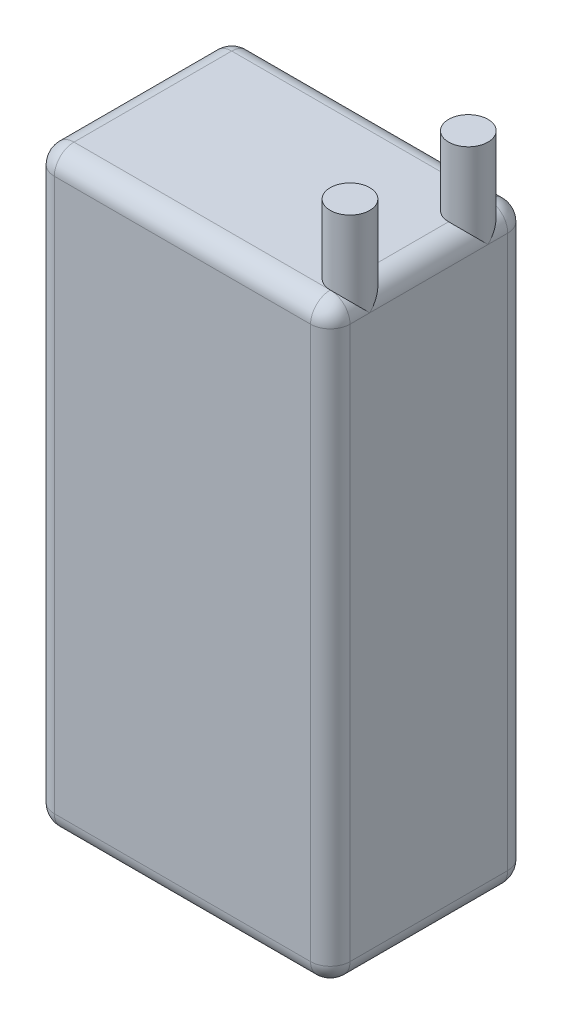
ISO-10303-21;
HEADER;
FILE_DESCRIPTION(('STEP AP214'),'2;1');
FILE_NAME('part.step','',(''),(''),'','','');
FILE_SCHEMA(('AUTOMOTIVE_DESIGN { 1 0 10303 214 1 1 1 1 }'));
ENDSEC;
DATA;
#1=APPLICATION_CONTEXT('core data for automotive mechanical design processes');
#2=APPLICATION_PROTOCOL_DEFINITION('international standard','automotive_design',2000,#1);
#3=PRODUCT_CONTEXT('',#1,'mechanical');
#4=PRODUCT('Part','Part','',(#3));
#5=PRODUCT_RELATED_PRODUCT_CATEGORY('part','',(#4));
#6=PRODUCT_DEFINITION_FORMATION('','',#4);
#7=PRODUCT_DEFINITION_CONTEXT('part definition',#1,'design');
#8=PRODUCT_DEFINITION('design','',#6,#7);
#9=PRODUCT_DEFINITION_SHAPE('','',#8);
#10=(LENGTH_UNIT() NAMED_UNIT(*) SI_UNIT(.MILLI.,.METRE.));
#11=(NAMED_UNIT(*) PLANE_ANGLE_UNIT() SI_UNIT($,.RADIAN.));
#12=(NAMED_UNIT(*) SI_UNIT($,.STERADIAN.) SOLID_ANGLE_UNIT());
#13=UNCERTAINTY_MEASURE_WITH_UNIT(LENGTH_MEASURE(1.E-05),#10,'distance_accuracy_value','');
#14=(GEOMETRIC_REPRESENTATION_CONTEXT(3) GLOBAL_UNCERTAINTY_ASSIGNED_CONTEXT((#13)) GLOBAL_UNIT_ASSIGNED_CONTEXT((#10,
#11,#12)) REPRESENTATION_CONTEXT('',''));
#15=CARTESIAN_POINT('',(0.,0.,0.));
#16=DIRECTION('',(0.,0.,1.));
#17=DIRECTION('',(1.,0.,0.));
#18=AXIS2_PLACEMENT_3D('',#15,#16,#17);
#19=CARTESIAN_POINT('',(-15.,60.,-10.));
#20=DIRECTION('',(1.,0.,0.));
#21=DIRECTION('',(0.,0.,-1.));
#22=AXIS2_PLACEMENT_3D('',#19,#20,#21);
#23=PLANE('',#22);
#24=DIRECTION('',(0.,-1.,0.));
#25=VECTOR('',#24,1.);
#26=CARTESIAN_POINT('',(-15.,60.,-8.));
#27=LINE('',#26,#25);
#28=CARTESIAN_POINT('',(-15.,58.,-8.));
#29=VERTEX_POINT('',#28);
#30=CARTESIAN_POINT('',(-15.,2.,-8.));
#31=VERTEX_POINT('',#30);
#32=EDGE_CURVE('E216',#29,#31,#27,.T.);
#33=ORIENTED_EDGE('',*,*,#32,.T.);
#34=DIRECTION('',(0.,0.,1.));
#35=VECTOR('',#34,1.);
#36=CARTESIAN_POINT('',(-15.,2.,10.));
#37=LINE('',#36,#35);
#38=CARTESIAN_POINT('',(-15.,2.,8.));
#39=VERTEX_POINT('',#38);
#40=EDGE_CURVE('E222',#31,#39,#37,.T.);
#41=ORIENTED_EDGE('',*,*,#40,.T.);
#42=DIRECTION('',(0.,-1.,0.));
#43=VECTOR('',#42,1.);
#44=CARTESIAN_POINT('',(-15.,60.,8.));
#45=LINE('',#44,#43);
#46=CARTESIAN_POINT('',(-15.,58.,8.));
#47=VERTEX_POINT('',#46);
#48=EDGE_CURVE('E220',#39,#47,#45,.F.);
#49=ORIENTED_EDGE('',*,*,#48,.T.);
#50=DIRECTION('',(0.,0.,1.));
#51=VECTOR('',#50,1.);
#52=CARTESIAN_POINT('',(-15.,58.,-10.));
#53=LINE('',#52,#51);
#54=EDGE_CURVE('E218',#47,#29,#53,.F.);
#55=ORIENTED_EDGE('',*,*,#54,.T.);
#56=EDGE_LOOP('',(#33,#41,#49,#55));
#57=FACE_BOUND('',#56,.T.);
#58=ADVANCED_FACE('F38',(#57),#23,.F.);
#59=CARTESIAN_POINT('',(15.,60.,10.));
#60=DIRECTION('',(0.,0.,-1.));
#61=DIRECTION('',(-1.,0.,0.));
#62=AXIS2_PLACEMENT_3D('',#59,#60,#61);
#63=PLANE('',#62);
#64=DIRECTION('',(0.,-1.,0.));
#65=VECTOR('',#64,1.);
#66=CARTESIAN_POINT('',(-13.,60.,10.));
#67=LINE('',#66,#65);
#68=CARTESIAN_POINT('',(-13.,58.,10.));
#69=VERTEX_POINT('',#68);
#70=CARTESIAN_POINT('',(-13.,2.,10.));
#71=VERTEX_POINT('',#70);
#72=EDGE_CURVE('E194',#69,#71,#67,.T.);
#73=ORIENTED_EDGE('',*,*,#72,.T.);
#74=DIRECTION('',(1.,0.,0.));
#75=VECTOR('',#74,1.);
#76=CARTESIAN_POINT('',(15.,2.,10.));
#77=LINE('',#76,#75);
#78=CARTESIAN_POINT('',(13.,2.,10.));
#79=VERTEX_POINT('',#78);
#80=EDGE_CURVE('E196',#71,#79,#77,.T.);
#81=ORIENTED_EDGE('',*,*,#80,.T.);
#82=DIRECTION('',(0.,-1.,0.));
#83=VECTOR('',#82,1.);
#84=CARTESIAN_POINT('',(13.,60.,10.));
#85=LINE('',#84,#83);
#86=CARTESIAN_POINT('',(13.,58.,10.));
#87=VERTEX_POINT('',#86);
#88=EDGE_CURVE('E192',#79,#87,#85,.F.);
#89=ORIENTED_EDGE('',*,*,#88,.T.);
#90=DIRECTION('',(1.,0.,0.));
#91=VECTOR('',#90,1.);
#92=CARTESIAN_POINT('',(15.,58.,10.));
#93=LINE('',#92,#91);
#94=EDGE_CURVE('E190',#87,#69,#93,.F.);
#95=ORIENTED_EDGE('',*,*,#94,.T.);
#96=EDGE_LOOP('',(#73,#81,#89,#95));
#97=FACE_BOUND('',#96,.T.);
#98=ADVANCED_FACE('F337',(#97),#63,.F.);
#99=CARTESIAN_POINT('',(15.,60.,-10.));
#100=DIRECTION('',(-1.,0.,0.));
#101=DIRECTION('',(0.,0.,1.));
#102=AXIS2_PLACEMENT_3D('',#99,#100,#101);
#103=PLANE('',#102);
#104=DIRECTION('',(0.,0.,-1.));
#105=VECTOR('',#104,1.);
#106=CARTESIAN_POINT('',(15.,58.,-10.));
#107=LINE('',#106,#105);
#108=CARTESIAN_POINT('',(15.,58.,-6.));
#109=VERTEX_POINT('',#108);
#110=CARTESIAN_POINT('',(15.,58.,6.));
#111=VERTEX_POINT('',#110);
#112=EDGE_CURVE('E186',#109,#111,#107,.F.);
#113=ORIENTED_EDGE('',*,*,#112,.T.);
#114=DIRECTION('',(0.,0.,-1.));
#115=VECTOR('',#114,1.);
#116=CARTESIAN_POINT('',(15.,58.,-10.));
#117=LINE('',#116,#115);
#118=CARTESIAN_POINT('',(15.,58.,8.));
#119=VERTEX_POINT('',#118);
#120=EDGE_CURVE('E62',#111,#119,#117,.F.);
#121=ORIENTED_EDGE('',*,*,#120,.T.);
#122=DIRECTION('',(0.,-1.,0.));
#123=VECTOR('',#122,1.);
#124=CARTESIAN_POINT('',(15.,60.,8.));
#125=LINE('',#124,#123);
#126=CARTESIAN_POINT('',(15.,2.,8.));
#127=VERTEX_POINT('',#126);
#128=EDGE_CURVE('E148',#119,#127,#125,.T.);
#129=ORIENTED_EDGE('',*,*,#128,.T.);
#130=DIRECTION('',(0.,0.,-1.));
#131=VECTOR('',#130,1.);
#132=CARTESIAN_POINT('',(15.,2.,-10.));
#133=LINE('',#132,#131);
#134=CARTESIAN_POINT('',(15.,2.,-8.));
#135=VERTEX_POINT('',#134);
#136=EDGE_CURVE('E140',#127,#135,#133,.T.);
#137=ORIENTED_EDGE('',*,*,#136,.T.);
#138=DIRECTION('',(0.,-1.,0.));
#139=VECTOR('',#138,1.);
#140=CARTESIAN_POINT('',(15.,60.,-8.));
#141=LINE('',#140,#139);
#142=CARTESIAN_POINT('',(15.,58.,-8.));
#143=VERTEX_POINT('',#142);
#144=EDGE_CURVE('E145',#135,#143,#141,.F.);
#145=ORIENTED_EDGE('',*,*,#144,.T.);
#146=DIRECTION('',(0.,0.,-1.));
#147=VECTOR('',#146,1.);
#148=CARTESIAN_POINT('',(15.,58.,-10.));
#149=LINE('',#148,#147);
#150=EDGE_CURVE('E152',#143,#109,#149,.F.);
#151=ORIENTED_EDGE('',*,*,#150,.T.);
#152=EDGE_LOOP('',(#113,#121,#129,#137,#145,#151));
#153=FACE_BOUND('',#152,.T.);
#154=ADVANCED_FACE('F143',(#153),#103,.F.);
#155=CARTESIAN_POINT('',(15.,60.,-10.));
#156=DIRECTION('',(0.,0.,1.));
#157=DIRECTION('',(1.,0.,0.));
#158=AXIS2_PLACEMENT_3D('',#155,#156,#157);
#159=PLANE('',#158);
#160=DIRECTION('',(0.,-1.,0.));
#161=VECTOR('',#160,1.);
#162=CARTESIAN_POINT('',(13.,60.,-10.));
#163=LINE('',#162,#161);
#164=CARTESIAN_POINT('',(13.,58.,-10.));
#165=VERTEX_POINT('',#164);
#166=CARTESIAN_POINT('',(13.,2.,-10.));
#167=VERTEX_POINT('',#166);
#168=EDGE_CURVE('E211',#165,#167,#163,.T.);
#169=ORIENTED_EDGE('',*,*,#168,.T.);
#170=DIRECTION('',(-1.,0.,0.));
#171=VECTOR('',#170,1.);
#172=CARTESIAN_POINT('',(-15.,2.,-10.));
#173=LINE('',#172,#171);
#174=CARTESIAN_POINT('',(-13.,2.,-10.));
#175=VERTEX_POINT('',#174);
#176=EDGE_CURVE('E213',#167,#175,#173,.T.);
#177=ORIENTED_EDGE('',*,*,#176,.T.);
#178=DIRECTION('',(0.,-1.,0.));
#179=VECTOR('',#178,1.);
#180=CARTESIAN_POINT('',(-13.,60.,-10.));
#181=LINE('',#180,#179);
#182=CARTESIAN_POINT('',(-13.,58.,-10.));
#183=VERTEX_POINT('',#182);
#184=EDGE_CURVE('E207',#175,#183,#181,.F.);
#185=ORIENTED_EDGE('',*,*,#184,.T.);
#186=DIRECTION('',(-1.,0.,0.));
#187=VECTOR('',#186,1.);
#188=CARTESIAN_POINT('',(15.,58.,-10.));
#189=LINE('',#188,#187);
#190=EDGE_CURVE('E209',#183,#165,#189,.F.);
#191=ORIENTED_EDGE('',*,*,#190,.T.);
#192=EDGE_LOOP('',(#169,#177,#185,#191));
#193=FACE_BOUND('',#192,.T.);
#194=ADVANCED_FACE('F356',(#193),#159,.F.);
#195=CARTESIAN_POINT('',(0.,60.,0.));
#196=DIRECTION('',(0.,-1.,0.));
#197=DIRECTION('',(0.,0.,-1.));
#198=AXIS2_PLACEMENT_3D('',#195,#196,#197);
#199=PLANE('',#198);
#200=CARTESIAN_POINT('',(13.,60.,6.));
#201=DIRECTION('',(0.,1.,0.));
#202=DIRECTION('',(0.,0.,1.));
#203=AXIS2_PLACEMENT_3D('',#200,#201,#202);
#204=CIRCLE('',#203,2.);
#205=CARTESIAN_POINT('',(13.,60.,4.));
#206=VERTEX_POINT('',#205);
#207=CARTESIAN_POINT('',(13.,60.,8.));
#208=VERTEX_POINT('',#207);
#209=EDGE_CURVE('E295',#206,#208,#204,.T.);
#210=ORIENTED_EDGE('',*,*,#209,.F.);
#211=DIRECTION('',(0.,0.,-1.));
#212=VECTOR('',#211,1.);
#213=CARTESIAN_POINT('',(13.,60.,0.));
#214=LINE('',#213,#212);
#215=CARTESIAN_POINT('',(13.,60.,-4.));
#216=VERTEX_POINT('',#215);
#217=EDGE_CURVE('E231',#206,#216,#214,.T.);
#218=ORIENTED_EDGE('',*,*,#217,.T.);
#219=CARTESIAN_POINT('',(13.,60.,-6.));
#220=DIRECTION('',(0.,1.,0.));
#221=DIRECTION('',(0.,0.,1.));
#222=AXIS2_PLACEMENT_3D('',#219,#220,#221);
#223=CIRCLE('',#222,2.);
#224=CARTESIAN_POINT('',(13.,60.,-8.));
#225=VERTEX_POINT('',#224);
#226=EDGE_CURVE('E181',#225,#216,#223,.T.);
#227=ORIENTED_EDGE('',*,*,#226,.F.);
#228=DIRECTION('',(-1.,0.,0.));
#229=VECTOR('',#228,1.);
#230=CARTESIAN_POINT('',(0.,60.,-8.));
#231=LINE('',#230,#229);
#232=CARTESIAN_POINT('',(-13.,60.,-8.));
#233=VERTEX_POINT('',#232);
#234=EDGE_CURVE('E225',#225,#233,#231,.T.);
#235=ORIENTED_EDGE('',*,*,#234,.T.);
#236=DIRECTION('',(0.,0.,1.));
#237=VECTOR('',#236,1.);
#238=CARTESIAN_POINT('',(-13.,60.,0.));
#239=LINE('',#238,#237);
#240=CARTESIAN_POINT('',(-13.,60.,8.));
#241=VERTEX_POINT('',#240);
#242=EDGE_CURVE('E227',#233,#241,#239,.T.);
#243=ORIENTED_EDGE('',*,*,#242,.T.);
#244=DIRECTION('',(1.,0.,0.));
#245=VECTOR('',#244,1.);
#246=CARTESIAN_POINT('',(0.,60.,8.));
#247=LINE('',#246,#245);
#248=EDGE_CURVE('E229',#241,#208,#247,.T.);
#249=ORIENTED_EDGE('',*,*,#248,.T.);
#250=EDGE_LOOP('',(#210,#218,#227,#235,#243,#249));
#251=FACE_BOUND('',#250,.T.);
#252=ADVANCED_FACE('F581',(#251),#199,.F.);
#253=CARTESIAN_POINT('',(0.,0.,0.));
#254=DIRECTION('',(0.,-1.,0.));
#255=DIRECTION('',(0.,0.,-1.));
#256=AXIS2_PLACEMENT_3D('',#253,#254,#255);
#257=PLANE('',#256);
#258=DIRECTION('',(0.,0.,-1.));
#259=VECTOR('',#258,1.);
#260=CARTESIAN_POINT('',(13.,0.,10.));
#261=LINE('',#260,#259);
#262=CARTESIAN_POINT('',(13.,0.,-8.));
#263=VERTEX_POINT('',#262);
#264=CARTESIAN_POINT('',(13.,0.,8.));
#265=VERTEX_POINT('',#264);
#266=EDGE_CURVE('E159',#263,#265,#261,.F.);
#267=ORIENTED_EDGE('',*,*,#266,.T.);
#268=DIRECTION('',(1.,0.,0.));
#269=VECTOR('',#268,1.);
#270=CARTESIAN_POINT('',(-15.,0.,8.));
#271=LINE('',#270,#269);
#272=CARTESIAN_POINT('',(-13.,0.,8.));
#273=VERTEX_POINT('',#272);
#274=EDGE_CURVE('E204',#265,#273,#271,.F.);
#275=ORIENTED_EDGE('',*,*,#274,.T.);
#276=DIRECTION('',(0.,0.,1.));
#277=VECTOR('',#276,1.);
#278=CARTESIAN_POINT('',(-13.,0.,-10.));
#279=LINE('',#278,#277);
#280=CARTESIAN_POINT('',(-13.,0.,-8.));
#281=VERTEX_POINT('',#280);
#282=EDGE_CURVE('E199',#273,#281,#279,.F.);
#283=ORIENTED_EDGE('',*,*,#282,.T.);
#284=DIRECTION('',(-1.,0.,0.));
#285=VECTOR('',#284,1.);
#286=CARTESIAN_POINT('',(15.,0.,-8.));
#287=LINE('',#286,#285);
#288=EDGE_CURVE('E201',#281,#263,#287,.F.);
#289=ORIENTED_EDGE('',*,*,#288,.T.);
#290=EDGE_LOOP('',(#267,#275,#283,#289));
#291=FACE_BOUND('',#290,.T.);
#292=ADVANCED_FACE('F350',(#291),#257,.T.);
#293=CARTESIAN_POINT('',(13.,67.,-6.));
#294=DIRECTION('',(0.,-1.,0.));
#295=DIRECTION('',(0.,0.,-1.));
#296=AXIS2_PLACEMENT_3D('',#293,#294,#295);
#297=CYLINDRICAL_SURFACE('',#296,2.);
#298=CARTESIAN_POINT('',(13.,67.,-6.));
#299=DIRECTION('',(0.,1.,0.));
#300=DIRECTION('',(0.,0.,1.));
#301=AXIS2_PLACEMENT_3D('',#298,#299,#300);
#302=CIRCLE('',#301,2.);
#303=CARTESIAN_POINT('',(13.,67.,-4.));
#304=VERTEX_POINT('',#303);
#305=EDGE_CURVE('E178',#304,#304,#302,.T.);
#306=ORIENTED_EDGE('',*,*,#305,.F.);
#307=EDGE_LOOP('',(#306));
#308=FACE_BOUND('',#307,.T.);
#309=ORIENTED_EDGE('',*,*,#226,.T.);
#310=CARTESIAN_POINT('',(13.,58.,-6.));
#311=DIRECTION('',(0.,-0.707106781186547,0.707106781186547));
#312=DIRECTION('',(0.,-0.707106781186547,-0.707106781186547));
#313=AXIS2_PLACEMENT_3D('',#310,#311,#312);
#314=ELLIPSE('',#313,2.82842712474619,2.);
#315=EDGE_CURVE('E47',#216,#109,#314,.F.);
#316=ORIENTED_EDGE('',*,*,#315,.T.);
#317=CARTESIAN_POINT('',(13.,58.,-6.));
#318=DIRECTION('',(0.,-0.707106781186547,-0.707106781186547));
#319=DIRECTION('',(0.,-0.707106781186547,0.707106781186547));
#320=AXIS2_PLACEMENT_3D('',#317,#318,#319);
#321=ELLIPSE('',#320,2.82842712474619,2.);
#322=EDGE_CURVE('E236',#109,#225,#321,.F.);
#323=ORIENTED_EDGE('',*,*,#322,.T.);
#324=EDGE_LOOP('',(#309,#316,#323));
#325=FACE_BOUND('',#324,.T.);
#326=ADVANCED_FACE('F311',(#308,#325),#297,.T.);
#327=CARTESIAN_POINT('',(13.,67.,-6.));
#328=DIRECTION('',(0.,1.,0.));
#329=DIRECTION('',(0.,0.,1.));
#330=AXIS2_PLACEMENT_3D('',#327,#328,#329);
#331=PLANE('',#330);
#332=ORIENTED_EDGE('',*,*,#305,.T.);
#333=EDGE_LOOP('',(#332));
#334=FACE_BOUND('',#333,.T.);
#335=ADVANCED_FACE('F556',(#334),#331,.T.);
#336=CARTESIAN_POINT('',(13.,67.,6.));
#337=DIRECTION('',(0.,-1.,0.));
#338=DIRECTION('',(0.,0.,-1.));
#339=AXIS2_PLACEMENT_3D('',#336,#337,#338);
#340=CYLINDRICAL_SURFACE('',#339,2.);
#341=CARTESIAN_POINT('',(13.,67.,6.));
#342=DIRECTION('',(0.,1.,0.));
#343=DIRECTION('',(0.,0.,1.));
#344=AXIS2_PLACEMENT_3D('',#341,#342,#343);
#345=CIRCLE('',#344,2.);
#346=CARTESIAN_POINT('',(13.,67.,8.));
#347=VERTEX_POINT('',#346);
#348=EDGE_CURVE('E301',#347,#347,#345,.T.);
#349=ORIENTED_EDGE('',*,*,#348,.F.);
#350=EDGE_LOOP('',(#349));
#351=FACE_BOUND('',#350,.T.);
#352=CARTESIAN_POINT('',(13.,58.,6.));
#353=DIRECTION('',(0.,-0.707106781186547,0.707106781186547));
#354=DIRECTION('',(0.,-0.707106781186547,-0.707106781186547));
#355=AXIS2_PLACEMENT_3D('',#352,#353,#354);
#356=ELLIPSE('',#355,2.82842712474619,2.);
#357=EDGE_CURVE('E233',#208,#111,#356,.F.);
#358=ORIENTED_EDGE('',*,*,#357,.T.);
#359=CARTESIAN_POINT('',(13.,58.,6.));
#360=DIRECTION('',(0.,-0.707106781186547,-0.707106781186547));
#361=DIRECTION('',(0.,-0.707106781186547,0.707106781186547));
#362=AXIS2_PLACEMENT_3D('',#359,#360,#361);
#363=ELLIPSE('',#362,2.82842712474619,2.);
#364=EDGE_CURVE('E11',#111,#206,#363,.F.);
#365=ORIENTED_EDGE('',*,*,#364,.T.);
#366=ORIENTED_EDGE('',*,*,#209,.T.);
#367=EDGE_LOOP('',(#358,#365,#366));
#368=FACE_BOUND('',#367,.T.);
#369=ADVANCED_FACE('F320',(#351,#368),#340,.T.);
#370=CARTESIAN_POINT('',(13.,67.,6.));
#371=DIRECTION('',(0.,1.,0.));
#372=DIRECTION('',(0.,0.,1.));
#373=AXIS2_PLACEMENT_3D('',#370,#371,#372);
#374=PLANE('',#373);
#375=ORIENTED_EDGE('',*,*,#348,.T.);
#376=EDGE_LOOP('',(#375));
#377=FACE_BOUND('',#376,.T.);
#378=ADVANCED_FACE('F539',(#377),#374,.T.);
#379=CARTESIAN_POINT('',(-13.,2.,-8.));
#380=DIRECTION('',(0.,0.,1.));
#381=DIRECTION('',(1.,0.,0.));
#382=AXIS2_PLACEMENT_3D('',#379,#380,#381);
#383=SPHERICAL_SURFACE('',#382,2.);
#384=CARTESIAN_POINT('',(-13.,2.,-8.));
#385=DIRECTION('',(-1.,0.,0.));
#386=DIRECTION('',(0.,0.,1.));
#387=AXIS2_PLACEMENT_3D('',#384,#385,#386);
#388=CIRCLE('',#387,2.);
#389=EDGE_CURVE('E286',#281,#175,#388,.F.);
#390=ORIENTED_EDGE('',*,*,#389,.F.);
#391=CARTESIAN_POINT('',(-13.,2.,-8.));
#392=DIRECTION('',(0.,0.,-1.));
#393=DIRECTION('',(-1.,0.,0.));
#394=AXIS2_PLACEMENT_3D('',#391,#392,#393);
#395=CIRCLE('',#394,2.);
#396=EDGE_CURVE('E42',#31,#281,#395,.F.);
#397=ORIENTED_EDGE('',*,*,#396,.F.);
#398=CARTESIAN_POINT('',(-13.,2.,-8.));
#399=DIRECTION('',(0.,-1.,0.));
#400=DIRECTION('',(0.,0.,-1.));
#401=AXIS2_PLACEMENT_3D('',#398,#399,#400);
#402=CIRCLE('',#401,2.);
#403=EDGE_CURVE('E288',#175,#31,#402,.F.);
#404=ORIENTED_EDGE('',*,*,#403,.F.);
#405=EDGE_LOOP('',(#390,#397,#404));
#406=FACE_BOUND('',#405,.T.);
#407=ADVANCED_FACE('F40',(#406),#383,.T.);
#408=CARTESIAN_POINT('',(-13.,2.,-10.));
#409=DIRECTION('',(0.,0.,-1.));
#410=DIRECTION('',(-1.,0.,0.));
#411=AXIS2_PLACEMENT_3D('',#408,#409,#410);
#412=CYLINDRICAL_SURFACE('',#411,2.);
#413=ORIENTED_EDGE('',*,*,#396,.T.);
#414=ORIENTED_EDGE('',*,*,#282,.F.);
#415=CARTESIAN_POINT('',(-13.,2.,8.));
#416=DIRECTION('',(0.,0.,1.));
#417=DIRECTION('',(1.,0.,0.));
#418=AXIS2_PLACEMENT_3D('',#415,#416,#417);
#419=CIRCLE('',#418,2.);
#420=EDGE_CURVE('E283',#39,#273,#419,.T.);
#421=ORIENTED_EDGE('',*,*,#420,.F.);
#422=ORIENTED_EDGE('',*,*,#40,.F.);
#423=EDGE_LOOP('',(#413,#414,#421,#422));
#424=FACE_BOUND('',#423,.T.);
#425=ADVANCED_FACE('F348',(#424),#412,.T.);
#426=CARTESIAN_POINT('',(-13.,60.,-8.));
#427=DIRECTION('',(0.,-1.,0.));
#428=DIRECTION('',(0.,0.,-1.));
#429=AXIS2_PLACEMENT_3D('',#426,#427,#428);
#430=CYLINDRICAL_SURFACE('',#429,2.);
#431=ORIENTED_EDGE('',*,*,#403,.T.);
#432=ORIENTED_EDGE('',*,*,#32,.F.);
#433=CARTESIAN_POINT('',(-13.,58.,-8.));
#434=DIRECTION('',(0.,1.,0.));
#435=DIRECTION('',(0.,0.,1.));
#436=AXIS2_PLACEMENT_3D('',#433,#434,#435);
#437=CIRCLE('',#436,2.);
#438=EDGE_CURVE('E280',#183,#29,#437,.T.);
#439=ORIENTED_EDGE('',*,*,#438,.F.);
#440=ORIENTED_EDGE('',*,*,#184,.F.);
#441=EDGE_LOOP('',(#431,#432,#439,#440));
#442=FACE_BOUND('',#441,.T.);
#443=ADVANCED_FACE('F518',(#442),#430,.T.);
#444=CARTESIAN_POINT('',(15.,2.,-8.));
#445=DIRECTION('',(1.,0.,0.));
#446=DIRECTION('',(0.,0.,-1.));
#447=AXIS2_PLACEMENT_3D('',#444,#445,#446);
#448=CYLINDRICAL_SURFACE('',#447,2.);
#449=ORIENTED_EDGE('',*,*,#389,.T.);
#450=ORIENTED_EDGE('',*,*,#176,.F.);
#451=CARTESIAN_POINT('',(13.,2.,-8.));
#452=DIRECTION('',(1.,0.,0.));
#453=DIRECTION('',(0.,0.,-1.));
#454=AXIS2_PLACEMENT_3D('',#451,#452,#453);
#455=CIRCLE('',#454,2.);
#456=EDGE_CURVE('E162',#263,#167,#455,.T.);
#457=ORIENTED_EDGE('',*,*,#456,.F.);
#458=ORIENTED_EDGE('',*,*,#288,.F.);
#459=EDGE_LOOP('',(#449,#450,#457,#458));
#460=FACE_BOUND('',#459,.T.);
#461=ADVANCED_FACE('F354',(#460),#448,.T.);
#462=CARTESIAN_POINT('',(-13.,2.,8.));
#463=DIRECTION('',(0.,0.,1.));
#464=DIRECTION('',(1.,0.,0.));
#465=AXIS2_PLACEMENT_3D('',#462,#463,#464);
#466=SPHERICAL_SURFACE('',#465,2.);
#467=CARTESIAN_POINT('',(-13.,2.,8.));
#468=DIRECTION('',(0.,-1.,0.));
#469=DIRECTION('',(0.,0.,-1.));
#470=AXIS2_PLACEMENT_3D('',#467,#468,#469);
#471=CIRCLE('',#470,2.);
#472=EDGE_CURVE('E275',#39,#71,#471,.F.);
#473=ORIENTED_EDGE('',*,*,#472,.F.);
#474=ORIENTED_EDGE('',*,*,#420,.T.);
#475=CARTESIAN_POINT('',(-13.,2.,8.));
#476=DIRECTION('',(-1.,0.,0.));
#477=DIRECTION('',(0.,0.,1.));
#478=AXIS2_PLACEMENT_3D('',#475,#476,#477);
#479=CIRCLE('',#478,2.);
#480=EDGE_CURVE('E163',#71,#273,#479,.F.);
#481=ORIENTED_EDGE('',*,*,#480,.F.);
#482=EDGE_LOOP('',(#473,#474,#481));
#483=FACE_BOUND('',#482,.T.);
#484=ADVANCED_FACE('F347',(#483),#466,.T.);
#485=CARTESIAN_POINT('',(-13.,58.,-8.));
#486=DIRECTION('',(0.,0.,1.));
#487=DIRECTION('',(1.,0.,0.));
#488=AXIS2_PLACEMENT_3D('',#485,#486,#487);
#489=SPHERICAL_SURFACE('',#488,2.);
#490=CARTESIAN_POINT('',(-13.,58.,-8.));
#491=DIRECTION('',(-1.,0.,0.));
#492=DIRECTION('',(0.,0.,1.));
#493=AXIS2_PLACEMENT_3D('',#490,#491,#492);
#494=CIRCLE('',#493,2.);
#495=EDGE_CURVE('E171',#183,#233,#494,.F.);
#496=ORIENTED_EDGE('',*,*,#495,.F.);
#497=ORIENTED_EDGE('',*,*,#438,.T.);
#498=CARTESIAN_POINT('',(-13.,58.,-8.));
#499=DIRECTION('',(0.,0.,-1.));
#500=DIRECTION('',(-1.,0.,0.));
#501=AXIS2_PLACEMENT_3D('',#498,#499,#500);
#502=CIRCLE('',#501,2.);
#503=EDGE_CURVE('E272',#233,#29,#502,.F.);
#504=ORIENTED_EDGE('',*,*,#503,.F.);
#505=EDGE_LOOP('',(#496,#497,#504));
#506=FACE_BOUND('',#505,.T.);
#507=ADVANCED_FACE('F495',(#506),#489,.T.);
#508=CARTESIAN_POINT('',(13.,2.,-8.));
#509=DIRECTION('',(0.,0.,1.));
#510=DIRECTION('',(1.,0.,0.));
#511=AXIS2_PLACEMENT_3D('',#508,#509,#510);
#512=SPHERICAL_SURFACE('',#511,2.);
#513=CARTESIAN_POINT('',(13.,2.,-8.));
#514=DIRECTION('',(0.,-1.,0.));
#515=DIRECTION('',(0.,0.,-1.));
#516=AXIS2_PLACEMENT_3D('',#513,#514,#515);
#517=CIRCLE('',#516,2.);
#518=EDGE_CURVE('E166',#135,#167,#517,.F.);
#519=ORIENTED_EDGE('',*,*,#518,.F.);
#520=CARTESIAN_POINT('',(13.,2.,-8.));
#521=DIRECTION('',(0.,0.,-1.));
#522=DIRECTION('',(-1.,0.,0.));
#523=AXIS2_PLACEMENT_3D('',#520,#521,#522);
#524=CIRCLE('',#523,2.);
#525=EDGE_CURVE('E156',#263,#135,#524,.F.);
#526=ORIENTED_EDGE('',*,*,#525,.F.);
#527=ORIENTED_EDGE('',*,*,#456,.T.);
#528=EDGE_LOOP('',(#519,#526,#527));
#529=FACE_BOUND('',#528,.T.);
#530=ADVANCED_FACE('F167',(#529),#512,.T.);
#531=CARTESIAN_POINT('',(13.,2.,-10.));
#532=DIRECTION('',(0.,0.,1.));
#533=DIRECTION('',(1.,0.,0.));
#534=AXIS2_PLACEMENT_3D('',#531,#532,#533);
#535=CYLINDRICAL_SURFACE('',#534,2.);
#536=ORIENTED_EDGE('',*,*,#525,.T.);
#537=ORIENTED_EDGE('',*,*,#136,.F.);
#538=CARTESIAN_POINT('',(13.,2.,8.));
#539=DIRECTION('',(0.,0.,1.));
#540=DIRECTION('',(1.,0.,0.));
#541=AXIS2_PLACEMENT_3D('',#538,#539,#540);
#542=CIRCLE('',#541,2.);
#543=EDGE_CURVE('E172',#265,#127,#542,.T.);
#544=ORIENTED_EDGE('',*,*,#543,.F.);
#545=ORIENTED_EDGE('',*,*,#266,.F.);
#546=EDGE_LOOP('',(#536,#537,#544,#545));
#547=FACE_BOUND('',#546,.T.);
#548=ADVANCED_FACE('F158',(#547),#535,.T.);
#549=CARTESIAN_POINT('',(15.,2.,8.));
#550=DIRECTION('',(-1.,0.,0.));
#551=DIRECTION('',(0.,0.,1.));
#552=AXIS2_PLACEMENT_3D('',#549,#550,#551);
#553=CYLINDRICAL_SURFACE('',#552,2.);
#554=ORIENTED_EDGE('',*,*,#480,.T.);
#555=ORIENTED_EDGE('',*,*,#274,.F.);
#556=CARTESIAN_POINT('',(13.,2.,8.));
#557=DIRECTION('',(1.,0.,0.));
#558=DIRECTION('',(0.,0.,-1.));
#559=AXIS2_PLACEMENT_3D('',#556,#557,#558);
#560=CIRCLE('',#559,2.);
#561=EDGE_CURVE('E266',#79,#265,#560,.T.);
#562=ORIENTED_EDGE('',*,*,#561,.F.);
#563=ORIENTED_EDGE('',*,*,#80,.F.);
#564=EDGE_LOOP('',(#554,#555,#562,#563));
#565=FACE_BOUND('',#564,.T.);
#566=ADVANCED_FACE('F335',(#565),#553,.T.);
#567=CARTESIAN_POINT('',(-13.,60.,8.));
#568=DIRECTION('',(0.,-1.,0.));
#569=DIRECTION('',(0.,0.,-1.));
#570=AXIS2_PLACEMENT_3D('',#567,#568,#569);
#571=CYLINDRICAL_SURFACE('',#570,2.);
#572=ORIENTED_EDGE('',*,*,#472,.T.);
#573=ORIENTED_EDGE('',*,*,#72,.F.);
#574=CARTESIAN_POINT('',(-13.,58.,8.));
#575=DIRECTION('',(0.,1.,0.));
#576=DIRECTION('',(0.,0.,1.));
#577=AXIS2_PLACEMENT_3D('',#574,#575,#576);
#578=CIRCLE('',#577,2.);
#579=EDGE_CURVE('E263',#47,#69,#578,.T.);
#580=ORIENTED_EDGE('',*,*,#579,.F.);
#581=ORIENTED_EDGE('',*,*,#48,.F.);
#582=EDGE_LOOP('',(#572,#573,#580,#581));
#583=FACE_BOUND('',#582,.T.);
#584=ADVANCED_FACE('F344',(#583),#571,.T.);
#585=CARTESIAN_POINT('',(-13.,58.,0.));
#586=DIRECTION('',(0.,0.,1.));
#587=DIRECTION('',(1.,0.,0.));
#588=AXIS2_PLACEMENT_3D('',#585,#586,#587);
#589=CYLINDRICAL_SURFACE('',#588,2.);
#590=ORIENTED_EDGE('',*,*,#503,.T.);
#591=ORIENTED_EDGE('',*,*,#54,.F.);
#592=CARTESIAN_POINT('',(-13.,58.,8.));
#593=DIRECTION('',(0.,0.,1.));
#594=DIRECTION('',(1.,0.,0.));
#595=AXIS2_PLACEMENT_3D('',#592,#593,#594);
#596=CIRCLE('',#595,2.);
#597=EDGE_CURVE('E260',#241,#47,#596,.T.);
#598=ORIENTED_EDGE('',*,*,#597,.F.);
#599=ORIENTED_EDGE('',*,*,#242,.F.);
#600=EDGE_LOOP('',(#590,#591,#598,#599));
#601=FACE_BOUND('',#600,.T.);
#602=ADVANCED_FACE('F458',(#601),#589,.T.);
#603=CARTESIAN_POINT('',(0.,58.,-8.));
#604=DIRECTION('',(-1.,0.,0.));
#605=DIRECTION('',(0.,0.,1.));
#606=AXIS2_PLACEMENT_3D('',#603,#604,#605);
#607=CYLINDRICAL_SURFACE('',#606,2.);
#608=ORIENTED_EDGE('',*,*,#495,.T.);
#609=ORIENTED_EDGE('',*,*,#234,.F.);
#610=CARTESIAN_POINT('',(13.,58.,-8.));
#611=DIRECTION('',(1.,0.,0.));
#612=DIRECTION('',(0.,1.,0.));
#613=AXIS2_PLACEMENT_3D('',#610,#611,#612);
#614=CIRCLE('',#613,2.);
#615=EDGE_CURVE('E257',#165,#225,#614,.T.);
#616=ORIENTED_EDGE('',*,*,#615,.F.);
#617=ORIENTED_EDGE('',*,*,#190,.F.);
#618=EDGE_LOOP('',(#608,#609,#616,#617));
#619=FACE_BOUND('',#618,.T.);
#620=ADVANCED_FACE('F361',(#619),#607,.T.);
#621=CARTESIAN_POINT('',(13.,60.,-8.));
#622=DIRECTION('',(0.,-1.,0.));
#623=DIRECTION('',(0.,0.,-1.));
#624=AXIS2_PLACEMENT_3D('',#621,#622,#623);
#625=CYLINDRICAL_SURFACE('',#624,2.);
#626=ORIENTED_EDGE('',*,*,#518,.T.);
#627=ORIENTED_EDGE('',*,*,#168,.F.);
#628=CARTESIAN_POINT('',(13.,58.,-8.));
#629=DIRECTION('',(0.,1.,0.));
#630=DIRECTION('',(0.,0.,1.));
#631=AXIS2_PLACEMENT_3D('',#628,#629,#630);
#632=CIRCLE('',#631,2.);
#633=EDGE_CURVE('E176',#143,#165,#632,.T.);
#634=ORIENTED_EDGE('',*,*,#633,.F.);
#635=ORIENTED_EDGE('',*,*,#144,.F.);
#636=EDGE_LOOP('',(#626,#627,#634,#635));
#637=FACE_BOUND('',#636,.T.);
#638=ADVANCED_FACE('F174',(#637),#625,.T.);
#639=CARTESIAN_POINT('',(13.,2.,8.));
#640=DIRECTION('',(0.,0.,1.));
#641=DIRECTION('',(1.,0.,0.));
#642=AXIS2_PLACEMENT_3D('',#639,#640,#641);
#643=SPHERICAL_SURFACE('',#642,2.);
#644=ORIENTED_EDGE('',*,*,#561,.T.);
#645=ORIENTED_EDGE('',*,*,#543,.T.);
#646=CARTESIAN_POINT('',(13.,2.,8.));
#647=DIRECTION('',(0.,-1.,0.));
#648=DIRECTION('',(0.,0.,-1.));
#649=AXIS2_PLACEMENT_3D('',#646,#647,#648);
#650=CIRCLE('',#649,2.);
#651=EDGE_CURVE('E253',#79,#127,#650,.F.);
#652=ORIENTED_EDGE('',*,*,#651,.F.);
#653=EDGE_LOOP('',(#644,#645,#652));
#654=FACE_BOUND('',#653,.T.);
#655=ADVANCED_FACE('F331',(#654),#643,.T.);
#656=CARTESIAN_POINT('',(-13.,58.,8.));
#657=DIRECTION('',(0.,0.,1.));
#658=DIRECTION('',(1.,0.,0.));
#659=AXIS2_PLACEMENT_3D('',#656,#657,#658);
#660=SPHERICAL_SURFACE('',#659,2.);
#661=ORIENTED_EDGE('',*,*,#597,.T.);
#662=ORIENTED_EDGE('',*,*,#579,.T.);
#663=CARTESIAN_POINT('',(-13.,58.,8.));
#664=DIRECTION('',(-1.,0.,0.));
#665=DIRECTION('',(0.,0.,1.));
#666=AXIS2_PLACEMENT_3D('',#663,#664,#665);
#667=CIRCLE('',#666,2.);
#668=EDGE_CURVE('E250',#241,#69,#667,.F.);
#669=ORIENTED_EDGE('',*,*,#668,.F.);
#670=EDGE_LOOP('',(#661,#662,#669));
#671=FACE_BOUND('',#670,.T.);
#672=ADVANCED_FACE('F428',(#671),#660,.T.);
#673=CARTESIAN_POINT('',(13.,58.,-8.));
#674=DIRECTION('',(0.,0.,1.));
#675=DIRECTION('',(1.,0.,0.));
#676=AXIS2_PLACEMENT_3D('',#673,#674,#675);
#677=SPHERICAL_SURFACE('',#676,2.);
#678=ORIENTED_EDGE('',*,*,#633,.T.);
#679=ORIENTED_EDGE('',*,*,#615,.T.);
#680=CARTESIAN_POINT('',(13.,58.,-8.));
#681=DIRECTION('',(0.,0.,-1.));
#682=DIRECTION('',(-1.,0.,0.));
#683=AXIS2_PLACEMENT_3D('',#680,#681,#682);
#684=CIRCLE('',#683,2.);
#685=EDGE_CURVE('E247',#143,#225,#684,.F.);
#686=ORIENTED_EDGE('',*,*,#685,.F.);
#687=EDGE_LOOP('',(#678,#679,#686));
#688=FACE_BOUND('',#687,.T.);
#689=ADVANCED_FACE('F363',(#688),#677,.T.);
#690=CARTESIAN_POINT('',(13.,60.,8.));
#691=DIRECTION('',(0.,-1.,0.));
#692=DIRECTION('',(0.,0.,-1.));
#693=AXIS2_PLACEMENT_3D('',#690,#691,#692);
#694=CYLINDRICAL_SURFACE('',#693,2.);
#695=ORIENTED_EDGE('',*,*,#651,.T.);
#696=ORIENTED_EDGE('',*,*,#128,.F.);
#697=CARTESIAN_POINT('',(13.,58.,8.));
#698=DIRECTION('',(0.,1.,0.));
#699=DIRECTION('',(0.,0.,1.));
#700=AXIS2_PLACEMENT_3D('',#697,#698,#699);
#701=CIRCLE('',#700,2.);
#702=EDGE_CURVE('E244',#87,#119,#701,.T.);
#703=ORIENTED_EDGE('',*,*,#702,.F.);
#704=ORIENTED_EDGE('',*,*,#88,.F.);
#705=EDGE_LOOP('',(#695,#696,#703,#704));
#706=FACE_BOUND('',#705,.T.);
#707=ADVANCED_FACE('F327',(#706),#694,.T.);
#708=CARTESIAN_POINT('',(0.,58.,8.));
#709=DIRECTION('',(1.,0.,0.));
#710=DIRECTION('',(0.,0.,-1.));
#711=AXIS2_PLACEMENT_3D('',#708,#709,#710);
#712=CYLINDRICAL_SURFACE('',#711,2.);
#713=ORIENTED_EDGE('',*,*,#668,.T.);
#714=ORIENTED_EDGE('',*,*,#94,.F.);
#715=CARTESIAN_POINT('',(13.,58.,8.));
#716=DIRECTION('',(1.,0.,0.));
#717=DIRECTION('',(0.,0.,-1.));
#718=AXIS2_PLACEMENT_3D('',#715,#716,#717);
#719=CIRCLE('',#718,2.);
#720=EDGE_CURVE('E241',#208,#87,#719,.T.);
#721=ORIENTED_EDGE('',*,*,#720,.F.);
#722=ORIENTED_EDGE('',*,*,#248,.F.);
#723=EDGE_LOOP('',(#713,#714,#721,#722));
#724=FACE_BOUND('',#723,.T.);
#725=ADVANCED_FACE('F367',(#724),#712,.T.);
#726=CARTESIAN_POINT('',(13.,58.,0.));
#727=DIRECTION('',(0.,0.,-1.));
#728=DIRECTION('',(-1.,0.,0.));
#729=AXIS2_PLACEMENT_3D('',#726,#727,#728);
#730=CYLINDRICAL_SURFACE('',#729,2.);
#731=ORIENTED_EDGE('',*,*,#685,.T.);
#732=ORIENTED_EDGE('',*,*,#322,.F.);
#733=ORIENTED_EDGE('',*,*,#150,.F.);
#734=EDGE_LOOP('',(#731,#732,#733));
#735=FACE_BOUND('',#734,.T.);
#736=ADVANCED_FACE('F365',(#735),#730,.T.);
#737=CARTESIAN_POINT('',(13.,58.,8.));
#738=DIRECTION('',(0.,0.,1.));
#739=DIRECTION('',(1.,0.,0.));
#740=AXIS2_PLACEMENT_3D('',#737,#738,#739);
#741=SPHERICAL_SURFACE('',#740,2.);
#742=ORIENTED_EDGE('',*,*,#720,.T.);
#743=ORIENTED_EDGE('',*,*,#702,.T.);
#744=CARTESIAN_POINT('',(13.,58.,8.));
#745=DIRECTION('',(0.,0.,1.));
#746=DIRECTION('',(0.,-1.,0.));
#747=AXIS2_PLACEMENT_3D('',#744,#745,#746);
#748=CIRCLE('',#747,2.);
#749=EDGE_CURVE('E239',#208,#119,#748,.F.);
#750=ORIENTED_EDGE('',*,*,#749,.F.);
#751=EDGE_LOOP('',(#742,#743,#750));
#752=FACE_BOUND('',#751,.T.);
#753=ADVANCED_FACE('F325',(#752),#741,.T.);
#754=CARTESIAN_POINT('',(13.,58.,0.));
#755=DIRECTION('',(0.,0.,-1.));
#756=DIRECTION('',(-1.,0.,0.));
#757=AXIS2_PLACEMENT_3D('',#754,#755,#756);
#758=CYLINDRICAL_SURFACE('',#757,2.);
#759=ORIENTED_EDGE('',*,*,#217,.F.);
#760=ORIENTED_EDGE('',*,*,#364,.F.);
#761=ORIENTED_EDGE('',*,*,#112,.F.);
#762=ORIENTED_EDGE('',*,*,#315,.F.);
#763=EDGE_LOOP('',(#759,#760,#761,#762));
#764=FACE_BOUND('',#763,.T.);
#765=ADVANCED_FACE('F318',(#764),#758,.T.);
#766=CARTESIAN_POINT('',(13.,58.,0.));
#767=DIRECTION('',(0.,0.,-1.));
#768=DIRECTION('',(-1.,0.,0.));
#769=AXIS2_PLACEMENT_3D('',#766,#767,#768);
#770=CYLINDRICAL_SURFACE('',#769,2.);
#771=ORIENTED_EDGE('',*,*,#749,.T.);
#772=ORIENTED_EDGE('',*,*,#120,.F.);
#773=ORIENTED_EDGE('',*,*,#357,.F.);
#774=EDGE_LOOP('',(#771,#772,#773));
#775=FACE_BOUND('',#774,.T.);
#776=ADVANCED_FACE('F321',(#775),#770,.T.);
#777=CLOSED_SHELL('',(#58,#98,#154,#194,#252,#292,#326,#335,#369,#378,#407,#425,#443,#461,#484,
#507,#530,#548,#566,#584,#602,#620,#638,#655,#672,#689,#707,#725,#736,#753,#765,#776));
#778=MANIFOLD_SOLID_BREP('B2',#777);
#779=ADVANCED_BREP_SHAPE_REPRESENTATION('',(#18,#778),#14);
#780=SHAPE_DEFINITION_REPRESENTATION(#9,#779);
ENDSEC;
END-ISO-10303-21;
